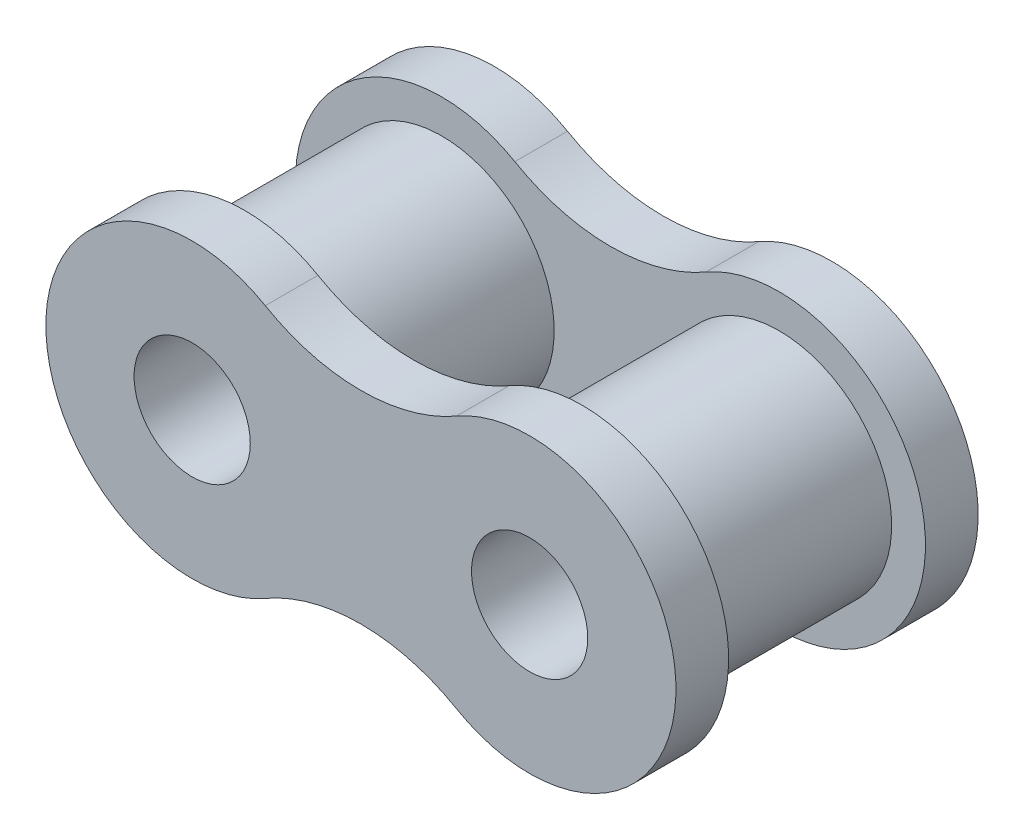
ISO-10303-21;
HEADER;
FILE_DESCRIPTION(('STEP AP214'),'2;1');
FILE_NAME('part.step','',(''),(''),'','','');
FILE_SCHEMA(('AUTOMOTIVE_DESIGN { 1 0 10303 214 1 1 1 1 }'));
ENDSEC;
DATA;
#1=APPLICATION_CONTEXT('core data for automotive mechanical design processes');
#2=APPLICATION_PROTOCOL_DEFINITION('international standard','automotive_design',2000,#1);
#3=PRODUCT_CONTEXT('',#1,'mechanical');
#4=PRODUCT('Part','Part','',(#3));
#5=PRODUCT_RELATED_PRODUCT_CATEGORY('part','',(#4));
#6=PRODUCT_DEFINITION_FORMATION('','',#4);
#7=PRODUCT_DEFINITION_CONTEXT('part definition',#1,'design');
#8=PRODUCT_DEFINITION('design','',#6,#7);
#9=PRODUCT_DEFINITION_SHAPE('','',#8);
#10=(LENGTH_UNIT() NAMED_UNIT(*) SI_UNIT(.MILLI.,.METRE.));
#11=(NAMED_UNIT(*) PLANE_ANGLE_UNIT() SI_UNIT($,.RADIAN.));
#12=(NAMED_UNIT(*) SI_UNIT($,.STERADIAN.) SOLID_ANGLE_UNIT());
#13=UNCERTAINTY_MEASURE_WITH_UNIT(LENGTH_MEASURE(1.E-05),#10,'distance_accuracy_value','');
#14=(GEOMETRIC_REPRESENTATION_CONTEXT(3) GLOBAL_UNCERTAINTY_ASSIGNED_CONTEXT((#13)) GLOBAL_UNIT_ASSIGNED_CONTEXT((#10,
#11,#12)) REPRESENTATION_CONTEXT('',''));
#15=CARTESIAN_POINT('',(0.,0.,0.));
#16=DIRECTION('',(0.,0.,1.));
#17=DIRECTION('',(1.,0.,0.));
#18=AXIS2_PLACEMENT_3D('',#15,#16,#17);
#19=CARTESIAN_POINT('',(9.525,0.,4.265));
#20=DIRECTION('',(0.,0.,1.));
#21=DIRECTION('',(-1.,0.,0.));
#22=AXIS2_PLACEMENT_3D('',#19,#20,#21);
#23=CYLINDRICAL_SURFACE('',#22,4.13);
#24=CARTESIAN_POINT('',(9.525,0.,4.265));
#25=DIRECTION('',(0.,0.,1.));
#26=DIRECTION('',(1.,0.,0.));
#27=AXIS2_PLACEMENT_3D('',#24,#25,#26);
#28=CIRCLE('',#27,4.13);
#29=CARTESIAN_POINT('',(7.4610834207765,-3.5773102121575,4.265));
#30=VERTEX_POINT('',#29);
#31=CARTESIAN_POINT('',(7.4610834207765,3.5773102121575,4.265));
#32=VERTEX_POINT('',#31);
#33=EDGE_CURVE('E165',#30,#32,#28,.T.);
#34=ORIENTED_EDGE('',*,*,#33,.F.);
#35=DIRECTION('',(0.,0.,-1.));
#36=VECTOR('',#35,1.);
#37=CARTESIAN_POINT('',(7.46108342077649,-3.5773102121575,4.265));
#38=LINE('',#37,#36);
#39=CARTESIAN_POINT('',(7.46108342077649,-3.5773102121575,2.778));
#40=VERTEX_POINT('',#39);
#41=EDGE_CURVE('E159',#30,#40,#38,.T.);
#42=ORIENTED_EDGE('',*,*,#41,.T.);
#43=CARTESIAN_POINT('',(9.525,0.,2.778));
#44=DIRECTION('',(0.,0.,1.));
#45=DIRECTION('',(1.,0.,0.));
#46=AXIS2_PLACEMENT_3D('',#43,#44,#45);
#47=CIRCLE('',#46,4.13);
#48=CARTESIAN_POINT('',(7.46108342077649,3.5773102121575,2.778));
#49=VERTEX_POINT('',#48);
#50=EDGE_CURVE('E161',#40,#49,#47,.T.);
#51=ORIENTED_EDGE('',*,*,#50,.T.);
#52=DIRECTION('',(0.,0.,-1.));
#53=VECTOR('',#52,1.);
#54=CARTESIAN_POINT('',(7.46108342077649,3.5773102121575,4.265));
#55=LINE('',#54,#53);
#56=EDGE_CURVE('E150',#32,#49,#55,.T.);
#57=ORIENTED_EDGE('',*,*,#56,.F.);
#58=EDGE_LOOP('',(#34,#42,#51,#57));
#59=FACE_BOUND('',#58,.T.);
#60=ADVANCED_FACE('F36',(#59),#23,.T.);
#61=CARTESIAN_POINT('',(9.525,0.,-11.3886204845838));
#62=DIRECTION('',(0.,0.,1.));
#63=DIRECTION('',(1.,0.,0.));
#64=AXIS2_PLACEMENT_3D('',#61,#62,#63);
#65=CYLINDRICAL_SURFACE('',#64,1.64);
#66=CARTESIAN_POINT('',(9.525,0.,-4.265));
#67=DIRECTION('',(0.,0.,1.));
#68=DIRECTION('',(1.,0.,0.));
#69=AXIS2_PLACEMENT_3D('',#66,#67,#68);
#70=CIRCLE('',#69,1.64);
#71=CARTESIAN_POINT('',(11.165,0.,-4.265));
#72=VERTEX_POINT('',#71);
#73=EDGE_CURVE('E153',#72,#72,#70,.F.);
#74=ORIENTED_EDGE('',*,*,#73,.T.);
#75=EDGE_LOOP('',(#74));
#76=FACE_BOUND('',#75,.T.);
#77=CARTESIAN_POINT('',(9.525,0.,4.265));
#78=DIRECTION('',(0.,0.,1.));
#79=DIRECTION('',(1.,0.,0.));
#80=AXIS2_PLACEMENT_3D('',#77,#78,#79);
#81=CIRCLE('',#80,1.64);
#82=CARTESIAN_POINT('',(11.165,0.,4.265));
#83=VERTEX_POINT('',#82);
#84=EDGE_CURVE('E40',#83,#83,#81,.F.);
#85=ORIENTED_EDGE('',*,*,#84,.F.);
#86=EDGE_LOOP('',(#85));
#87=FACE_BOUND('',#86,.T.);
#88=ADVANCED_FACE('F198',(#76,#87),#65,.F.);
#89=CARTESIAN_POINT('',(4.7625,-8.25466496897361,4.265));
#90=DIRECTION('',(0.,0.,1.));
#91=DIRECTION('',(-1.,0.,0.));
#92=AXIS2_PLACEMENT_3D('',#89,#90,#91);
#93=CYLINDRICAL_SURFACE('',#92,5.4);
#94=CARTESIAN_POINT('',(4.7625,-8.25466496897361,2.778));
#95=DIRECTION('',(0.,0.,1.));
#96=DIRECTION('',(1.,0.,0.));
#97=AXIS2_PLACEMENT_3D('',#94,#95,#96);
#98=CIRCLE('',#97,5.4);
#99=CARTESIAN_POINT('',(2.0639165792235,-3.5773102121575,2.778));
#100=VERTEX_POINT('',#99);
#101=EDGE_CURVE('E55',#40,#100,#98,.T.);
#102=ORIENTED_EDGE('',*,*,#101,.F.);
#103=ORIENTED_EDGE('',*,*,#41,.F.);
#104=CARTESIAN_POINT('',(4.7625,-8.25466496897361,4.265));
#105=DIRECTION('',(0.,0.,1.));
#106=DIRECTION('',(1.,0.,0.));
#107=AXIS2_PLACEMENT_3D('',#104,#105,#106);
#108=CIRCLE('',#107,5.4);
#109=CARTESIAN_POINT('',(2.0639165792235,-3.5773102121575,4.265));
#110=VERTEX_POINT('',#109);
#111=EDGE_CURVE('E11',#30,#110,#108,.T.);
#112=ORIENTED_EDGE('',*,*,#111,.T.);
#113=DIRECTION('',(0.,0.,-1.));
#114=VECTOR('',#113,1.);
#115=CARTESIAN_POINT('',(2.0639165792235,-3.5773102121575,4.265));
#116=LINE('',#115,#114);
#117=EDGE_CURVE('E46',#110,#100,#116,.T.);
#118=ORIENTED_EDGE('',*,*,#117,.T.);
#119=EDGE_LOOP('',(#102,#103,#112,#118));
#120=FACE_BOUND('',#119,.T.);
#121=ADVANCED_FACE('F200',(#120),#93,.F.);
#122=CARTESIAN_POINT('',(0.,0.,4.265));
#123=DIRECTION('',(0.,0.,1.));
#124=DIRECTION('',(-1.,0.,0.));
#125=AXIS2_PLACEMENT_3D('',#122,#123,#124);
#126=CYLINDRICAL_SURFACE('',#125,4.13);
#127=CARTESIAN_POINT('',(0.,0.,2.778));
#128=DIRECTION('',(0.,0.,1.));
#129=DIRECTION('',(1.,0.,0.));
#130=AXIS2_PLACEMENT_3D('',#127,#128,#129);
#131=CIRCLE('',#130,4.13);
#132=CARTESIAN_POINT('',(2.06391657922351,3.5773102121575,2.778));
#133=VERTEX_POINT('',#132);
#134=EDGE_CURVE('E154',#133,#100,#131,.T.);
#135=ORIENTED_EDGE('',*,*,#134,.T.);
#136=ORIENTED_EDGE('',*,*,#117,.F.);
#137=CARTESIAN_POINT('',(0.,0.,4.265));
#138=DIRECTION('',(0.,0.,1.));
#139=DIRECTION('',(1.,0.,0.));
#140=AXIS2_PLACEMENT_3D('',#137,#138,#139);
#141=CIRCLE('',#140,4.13);
#142=CARTESIAN_POINT('',(2.06391657922351,3.5773102121575,4.265));
#143=VERTEX_POINT('',#142);
#144=EDGE_CURVE('E136',#143,#110,#141,.T.);
#145=ORIENTED_EDGE('',*,*,#144,.F.);
#146=DIRECTION('',(0.,0.,-1.));
#147=VECTOR('',#146,1.);
#148=CARTESIAN_POINT('',(2.06391657922351,3.5773102121575,4.265));
#149=LINE('',#148,#147);
#150=EDGE_CURVE('E157',#143,#133,#149,.T.);
#151=ORIENTED_EDGE('',*,*,#150,.T.);
#152=EDGE_LOOP('',(#135,#136,#145,#151));
#153=FACE_BOUND('',#152,.T.);
#154=ADVANCED_FACE('F206',(#153),#126,.T.);
#155=CARTESIAN_POINT('',(7.14375,4.1273324844868,4.265));
#156=DIRECTION('',(0.,0.,1.));
#157=DIRECTION('',(1.,0.,0.));
#158=AXIS2_PLACEMENT_3D('',#155,#156,#157);
#159=PLANE('',#158);
#160=ORIENTED_EDGE('',*,*,#111,.F.);
#161=ORIENTED_EDGE('',*,*,#33,.T.);
#162=CARTESIAN_POINT('',(4.7625,8.25466496897361,4.265));
#163=DIRECTION('',(0.,0.,1.));
#164=DIRECTION('',(1.,0.,0.));
#165=AXIS2_PLACEMENT_3D('',#162,#163,#164);
#166=CIRCLE('',#165,5.4);
#167=EDGE_CURVE('E152',#143,#32,#166,.T.);
#168=ORIENTED_EDGE('',*,*,#167,.F.);
#169=ORIENTED_EDGE('',*,*,#144,.T.);
#170=EDGE_LOOP('',(#160,#161,#168,#169));
#171=FACE_BOUND('',#170,.T.);
#172=CARTESIAN_POINT('',(0.,0.,4.265));
#173=DIRECTION('',(0.,0.,1.));
#174=DIRECTION('',(1.,0.,0.));
#175=AXIS2_PLACEMENT_3D('',#172,#173,#174);
#176=CIRCLE('',#175,1.64);
#177=CARTESIAN_POINT('',(1.64,0.,4.265));
#178=VERTEX_POINT('',#177);
#179=EDGE_CURVE('E173',#178,#178,#176,.T.);
#180=ORIENTED_EDGE('',*,*,#179,.F.);
#181=EDGE_LOOP('',(#180));
#182=FACE_BOUND('',#181,.T.);
#183=ORIENTED_EDGE('',*,*,#84,.T.);
#184=EDGE_LOOP('',(#183));
#185=FACE_BOUND('',#184,.T.);
#186=ADVANCED_FACE('F196',(#171,#182,#185),#159,.T.);
#187=CARTESIAN_POINT('',(7.14375,4.1273324844868,-2.778));
#188=DIRECTION('',(0.,0.,1.));
#189=DIRECTION('',(1.,0.,0.));
#190=AXIS2_PLACEMENT_3D('',#187,#188,#189);
#191=PLANE('',#190);
#192=CARTESIAN_POINT('',(4.7625,8.25466496897361,-2.778));
#193=DIRECTION('',(0.,0.,1.));
#194=DIRECTION('',(1.,0.,0.));
#195=AXIS2_PLACEMENT_3D('',#192,#193,#194);
#196=CIRCLE('',#195,5.4);
#197=CARTESIAN_POINT('',(2.06391657922351,3.5773102121575,-2.778));
#198=VERTEX_POINT('',#197);
#199=CARTESIAN_POINT('',(7.46108342077649,3.5773102121575,-2.778));
#200=VERTEX_POINT('',#199);
#201=EDGE_CURVE('E116',#198,#200,#196,.T.);
#202=ORIENTED_EDGE('',*,*,#201,.F.);
#203=CARTESIAN_POINT('',(0.,0.,-2.778));
#204=DIRECTION('',(0.,0.,1.));
#205=DIRECTION('',(1.,0.,0.));
#206=AXIS2_PLACEMENT_3D('',#203,#204,#205);
#207=CIRCLE('',#206,4.13);
#208=CARTESIAN_POINT('',(2.0639165792235,-3.5773102121575,-2.778));
#209=VERTEX_POINT('',#208);
#210=EDGE_CURVE('E131',#198,#209,#207,.T.);
#211=ORIENTED_EDGE('',*,*,#210,.T.);
#212=CARTESIAN_POINT('',(4.7625,-8.25466496897361,-2.778));
#213=DIRECTION('',(0.,0.,1.));
#214=DIRECTION('',(1.,0.,0.));
#215=AXIS2_PLACEMENT_3D('',#212,#213,#214);
#216=CIRCLE('',#215,5.4);
#217=CARTESIAN_POINT('',(7.46108342077649,-3.5773102121575,-2.778));
#218=VERTEX_POINT('',#217);
#219=EDGE_CURVE('E122',#218,#209,#216,.T.);
#220=ORIENTED_EDGE('',*,*,#219,.F.);
#221=CARTESIAN_POINT('',(9.525,0.,-2.778));
#222=DIRECTION('',(0.,0.,1.));
#223=DIRECTION('',(1.,0.,0.));
#224=AXIS2_PLACEMENT_3D('',#221,#222,#223);
#225=CIRCLE('',#224,4.13);
#226=EDGE_CURVE('E137',#218,#200,#225,.T.);
#227=ORIENTED_EDGE('',*,*,#226,.T.);
#228=EDGE_LOOP('',(#202,#211,#220,#227));
#229=FACE_BOUND('',#228,.T.);
#230=CARTESIAN_POINT('',(0.,0.,-2.778));
#231=DIRECTION('',(0.,0.,-1.));
#232=DIRECTION('',(-1.,0.,0.));
#233=AXIS2_PLACEMENT_3D('',#230,#231,#232);
#234=CIRCLE('',#233,3.175);
#235=CARTESIAN_POINT('',(-3.175,0.,-2.778));
#236=VERTEX_POINT('',#235);
#237=EDGE_CURVE('E170',#236,#236,#234,.T.);
#238=ORIENTED_EDGE('',*,*,#237,.T.);
#239=EDGE_LOOP('',(#238));
#240=FACE_BOUND('',#239,.T.);
#241=CARTESIAN_POINT('',(9.525,0.,-2.778));
#242=DIRECTION('',(0.,0.,-1.));
#243=DIRECTION('',(-1.,0.,0.));
#244=AXIS2_PLACEMENT_3D('',#241,#242,#243);
#245=CIRCLE('',#244,3.175);
#246=CARTESIAN_POINT('',(6.35,0.,-2.778));
#247=VERTEX_POINT('',#246);
#248=EDGE_CURVE('E99',#247,#247,#245,.T.);
#249=ORIENTED_EDGE('',*,*,#248,.T.);
#250=EDGE_LOOP('',(#249));
#251=FACE_BOUND('',#250,.T.);
#252=ADVANCED_FACE('F38',(#229,#240,#251),#191,.T.);
#253=CARTESIAN_POINT('',(7.14375,4.1273324844868,2.778));
#254=DIRECTION('',(0.,0.,1.));
#255=DIRECTION('',(1.,0.,0.));
#256=AXIS2_PLACEMENT_3D('',#253,#254,#255);
#257=PLANE('',#256);
#258=CARTESIAN_POINT('',(4.7625,8.25466496897361,2.778));
#259=DIRECTION('',(0.,0.,1.));
#260=DIRECTION('',(1.,0.,0.));
#261=AXIS2_PLACEMENT_3D('',#258,#259,#260);
#262=CIRCLE('',#261,5.4);
#263=EDGE_CURVE('E171',#133,#49,#262,.T.);
#264=ORIENTED_EDGE('',*,*,#263,.T.);
#265=ORIENTED_EDGE('',*,*,#50,.F.);
#266=ORIENTED_EDGE('',*,*,#101,.T.);
#267=ORIENTED_EDGE('',*,*,#134,.F.);
#268=EDGE_LOOP('',(#264,#265,#266,#267));
#269=FACE_BOUND('',#268,.T.);
#270=CARTESIAN_POINT('',(9.525,0.,2.778));
#271=DIRECTION('',(0.,0.,-1.));
#272=DIRECTION('',(1.,0.,0.));
#273=AXIS2_PLACEMENT_3D('',#270,#271,#272);
#274=CIRCLE('',#273,3.175);
#275=CARTESIAN_POINT('',(12.7,0.,2.778));
#276=VERTEX_POINT('',#275);
#277=EDGE_CURVE('E105',#276,#276,#274,.T.);
#278=ORIENTED_EDGE('',*,*,#277,.F.);
#279=EDGE_LOOP('',(#278));
#280=FACE_BOUND('',#279,.T.);
#281=CARTESIAN_POINT('',(0.,0.,2.778));
#282=DIRECTION('',(0.,0.,-1.));
#283=DIRECTION('',(-1.,0.,0.));
#284=AXIS2_PLACEMENT_3D('',#281,#282,#283);
#285=CIRCLE('',#284,3.175);
#286=CARTESIAN_POINT('',(-3.175,0.,2.778));
#287=VERTEX_POINT('',#286);
#288=EDGE_CURVE('E167',#287,#287,#285,.T.);
#289=ORIENTED_EDGE('',*,*,#288,.F.);
#290=EDGE_LOOP('',(#289));
#291=FACE_BOUND('',#290,.T.);
#292=ADVANCED_FACE('F214',(#269,#280,#291),#257,.F.);
#293=CARTESIAN_POINT('',(0.,0.,4.265));
#294=DIRECTION('',(0.,0.,1.));
#295=DIRECTION('',(-1.,0.,0.));
#296=AXIS2_PLACEMENT_3D('',#293,#294,#295);
#297=CYLINDRICAL_SURFACE('',#296,1.64);
#298=CARTESIAN_POINT('',(0.,0.,-4.265));
#299=DIRECTION('',(0.,0.,1.));
#300=DIRECTION('',(1.,0.,0.));
#301=AXIS2_PLACEMENT_3D('',#298,#299,#300);
#302=CIRCLE('',#301,1.64);
#303=CARTESIAN_POINT('',(1.64,0.,-4.265));
#304=VERTEX_POINT('',#303);
#305=EDGE_CURVE('E184',#304,#304,#302,.T.);
#306=ORIENTED_EDGE('',*,*,#305,.F.);
#307=EDGE_LOOP('',(#306));
#308=FACE_BOUND('',#307,.T.);
#309=ORIENTED_EDGE('',*,*,#179,.T.);
#310=EDGE_LOOP('',(#309));
#311=FACE_BOUND('',#310,.T.);
#312=ADVANCED_FACE('F211',(#308,#311),#297,.F.);
#313=CARTESIAN_POINT('',(7.14375,4.1273324844868,-4.265));
#314=DIRECTION('',(0.,0.,1.));
#315=DIRECTION('',(1.,0.,0.));
#316=AXIS2_PLACEMENT_3D('',#313,#314,#315);
#317=PLANE('',#316);
#318=CARTESIAN_POINT('',(4.7625,8.25466496897361,-4.265));
#319=DIRECTION('',(0.,0.,1.));
#320=DIRECTION('',(1.,0.,0.));
#321=AXIS2_PLACEMENT_3D('',#318,#319,#320);
#322=CIRCLE('',#321,5.4);
#323=CARTESIAN_POINT('',(2.06391657922351,3.5773102121575,-4.265));
#324=VERTEX_POINT('',#323);
#325=CARTESIAN_POINT('',(7.4610834207765,3.5773102121575,-4.265));
#326=VERTEX_POINT('',#325);
#327=EDGE_CURVE('E176',#324,#326,#322,.T.);
#328=ORIENTED_EDGE('',*,*,#327,.T.);
#329=CARTESIAN_POINT('',(9.525,0.,-4.265));
#330=DIRECTION('',(0.,0.,-1.));
#331=DIRECTION('',(1.,0.,0.));
#332=AXIS2_PLACEMENT_3D('',#329,#330,#331);
#333=CIRCLE('',#332,4.13);
#334=CARTESIAN_POINT('',(7.4610834207765,-3.5773102121575,-4.265));
#335=VERTEX_POINT('',#334);
#336=EDGE_CURVE('E162',#326,#335,#333,.T.);
#337=ORIENTED_EDGE('',*,*,#336,.T.);
#338=CARTESIAN_POINT('',(4.7625,-8.25466496897361,-4.265));
#339=DIRECTION('',(0.,0.,1.));
#340=DIRECTION('',(1.,0.,0.));
#341=AXIS2_PLACEMENT_3D('',#338,#339,#340);
#342=CIRCLE('',#341,5.4);
#343=CARTESIAN_POINT('',(2.0639165792235,-3.5773102121575,-4.265));
#344=VERTEX_POINT('',#343);
#345=EDGE_CURVE('E182',#335,#344,#342,.T.);
#346=ORIENTED_EDGE('',*,*,#345,.T.);
#347=CARTESIAN_POINT('',(0.,0.,-4.265));
#348=DIRECTION('',(0.,0.,1.));
#349=DIRECTION('',(1.,0.,0.));
#350=AXIS2_PLACEMENT_3D('',#347,#348,#349);
#351=CIRCLE('',#350,4.13);
#352=EDGE_CURVE('E140',#324,#344,#351,.T.);
#353=ORIENTED_EDGE('',*,*,#352,.F.);
#354=EDGE_LOOP('',(#328,#337,#346,#353));
#355=FACE_BOUND('',#354,.T.);
#356=ORIENTED_EDGE('',*,*,#305,.T.);
#357=EDGE_LOOP('',(#356));
#358=FACE_BOUND('',#357,.T.);
#359=ORIENTED_EDGE('',*,*,#73,.F.);
#360=EDGE_LOOP('',(#359));
#361=FACE_BOUND('',#360,.T.);
#362=ADVANCED_FACE('F213',(#355,#358,#361),#317,.F.);
#363=CARTESIAN_POINT('',(9.525,0.,-6.75));
#364=DIRECTION('',(0.,0.,1.));
#365=DIRECTION('',(-1.,0.,0.));
#366=AXIS2_PLACEMENT_3D('',#363,#364,#365);
#367=CYLINDRICAL_SURFACE('',#366,3.175);
#368=ORIENTED_EDGE('',*,*,#277,.T.);
#369=EDGE_LOOP('',(#368));
#370=FACE_BOUND('',#369,.T.);
#371=ORIENTED_EDGE('',*,*,#248,.F.);
#372=EDGE_LOOP('',(#371));
#373=FACE_BOUND('',#372,.T.);
#374=ADVANCED_FACE('F222',(#370,#373),#367,.T.);
#375=CARTESIAN_POINT('',(0.,0.,-4.265));
#376=DIRECTION('',(0.,0.,-1.));
#377=DIRECTION('',(1.,0.,0.));
#378=AXIS2_PLACEMENT_3D('',#375,#376,#377);
#379=CYLINDRICAL_SURFACE('',#378,4.13);
#380=ORIENTED_EDGE('',*,*,#210,.F.);
#381=DIRECTION('',(0.,0.,1.));
#382=VECTOR('',#381,1.);
#383=CARTESIAN_POINT('',(2.06391657922351,3.5773102121575,-4.265));
#384=LINE('',#383,#382);
#385=EDGE_CURVE('E149',#324,#198,#384,.T.);
#386=ORIENTED_EDGE('',*,*,#385,.F.);
#387=ORIENTED_EDGE('',*,*,#352,.T.);
#388=DIRECTION('',(0.,0.,1.));
#389=VECTOR('',#388,1.);
#390=CARTESIAN_POINT('',(2.0639165792235,-3.5773102121575,-4.265));
#391=LINE('',#390,#389);
#392=EDGE_CURVE('E126',#344,#209,#391,.T.);
#393=ORIENTED_EDGE('',*,*,#392,.T.);
#394=EDGE_LOOP('',(#380,#386,#387,#393));
#395=FACE_BOUND('',#394,.T.);
#396=ADVANCED_FACE('F139',(#395),#379,.T.);
#397=CARTESIAN_POINT('',(4.7625,-8.25466496897361,-4.265));
#398=DIRECTION('',(0.,0.,-1.));
#399=DIRECTION('',(1.,0.,0.));
#400=AXIS2_PLACEMENT_3D('',#397,#398,#399);
#401=CYLINDRICAL_SURFACE('',#400,5.4);
#402=ORIENTED_EDGE('',*,*,#219,.T.);
#403=ORIENTED_EDGE('',*,*,#392,.F.);
#404=ORIENTED_EDGE('',*,*,#345,.F.);
#405=DIRECTION('',(0.,0.,1.));
#406=VECTOR('',#405,1.);
#407=CARTESIAN_POINT('',(7.46108342077649,-3.5773102121575,-4.265));
#408=LINE('',#407,#406);
#409=EDGE_CURVE('E128',#335,#218,#408,.T.);
#410=ORIENTED_EDGE('',*,*,#409,.T.);
#411=EDGE_LOOP('',(#402,#403,#404,#410));
#412=FACE_BOUND('',#411,.T.);
#413=ADVANCED_FACE('F123',(#412),#401,.F.);
#414=CARTESIAN_POINT('',(9.525,0.,-4.265));
#415=DIRECTION('',(0.,0.,-1.));
#416=DIRECTION('',(1.,0.,0.));
#417=AXIS2_PLACEMENT_3D('',#414,#415,#416);
#418=CYLINDRICAL_SURFACE('',#417,4.13);
#419=ORIENTED_EDGE('',*,*,#409,.F.);
#420=ORIENTED_EDGE('',*,*,#336,.F.);
#421=DIRECTION('',(0.,0.,1.));
#422=VECTOR('',#421,1.);
#423=CARTESIAN_POINT('',(7.46108342077649,3.5773102121575,-4.265));
#424=LINE('',#423,#422);
#425=EDGE_CURVE('E145',#326,#200,#424,.T.);
#426=ORIENTED_EDGE('',*,*,#425,.T.);
#427=ORIENTED_EDGE('',*,*,#226,.F.);
#428=EDGE_LOOP('',(#419,#420,#426,#427));
#429=FACE_BOUND('',#428,.T.);
#430=ADVANCED_FACE('F231',(#429),#418,.T.);
#431=CARTESIAN_POINT('',(4.7625,8.25466496897361,-4.265));
#432=DIRECTION('',(0.,0.,-1.));
#433=DIRECTION('',(1.,0.,0.));
#434=AXIS2_PLACEMENT_3D('',#431,#432,#433);
#435=CYLINDRICAL_SURFACE('',#434,5.4);
#436=ORIENTED_EDGE('',*,*,#201,.T.);
#437=ORIENTED_EDGE('',*,*,#425,.F.);
#438=ORIENTED_EDGE('',*,*,#327,.F.);
#439=ORIENTED_EDGE('',*,*,#385,.T.);
#440=EDGE_LOOP('',(#436,#437,#438,#439));
#441=FACE_BOUND('',#440,.T.);
#442=ADVANCED_FACE('F236',(#441),#435,.F.);
#443=CARTESIAN_POINT('',(0.,0.,-2.778));
#444=DIRECTION('',(0.,0.,1.));
#445=DIRECTION('',(-1.,0.,0.));
#446=AXIS2_PLACEMENT_3D('',#443,#444,#445);
#447=CYLINDRICAL_SURFACE('',#446,3.175);
#448=ORIENTED_EDGE('',*,*,#237,.F.);
#449=EDGE_LOOP('',(#448));
#450=FACE_BOUND('',#449,.T.);
#451=ORIENTED_EDGE('',*,*,#288,.T.);
#452=EDGE_LOOP('',(#451));
#453=FACE_BOUND('',#452,.T.);
#454=ADVANCED_FACE('F232',(#450,#453),#447,.T.);
#455=CARTESIAN_POINT('',(4.7625,8.25466496897361,4.265));
#456=DIRECTION('',(0.,0.,1.));
#457=DIRECTION('',(-1.,0.,0.));
#458=AXIS2_PLACEMENT_3D('',#455,#456,#457);
#459=CYLINDRICAL_SURFACE('',#458,5.4);
#460=ORIENTED_EDGE('',*,*,#263,.F.);
#461=ORIENTED_EDGE('',*,*,#150,.F.);
#462=ORIENTED_EDGE('',*,*,#167,.T.);
#463=ORIENTED_EDGE('',*,*,#56,.T.);
#464=EDGE_LOOP('',(#460,#461,#462,#463));
#465=FACE_BOUND('',#464,.T.);
#466=ADVANCED_FACE('F235',(#465),#459,.F.);
#467=CLOSED_SHELL('',(#60,#88,#121,#154,#186,#252,#292,#312,#362,#374,#396,#413,#430,#442,#454,#466));
#468=MANIFOLD_SOLID_BREP('B2',#467);
#469=ADVANCED_BREP_SHAPE_REPRESENTATION('',(#18,#468),#14);
#470=SHAPE_DEFINITION_REPRESENTATION(#9,#469);
ENDSEC;
END-ISO-10303-21;
